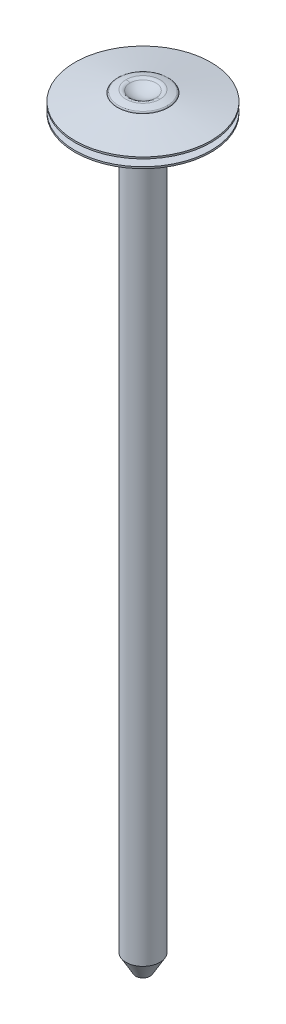
ISO-10303-21;
HEADER;
FILE_DESCRIPTION(('STEP AP214'),'2;1');
FILE_NAME('part.step','',(''),(''),'','','');
FILE_SCHEMA(('AUTOMOTIVE_DESIGN { 1 0 10303 214 1 1 1 1 }'));
ENDSEC;
DATA;
#1=APPLICATION_CONTEXT('core data for automotive mechanical design processes');
#2=APPLICATION_PROTOCOL_DEFINITION('international standard','automotive_design',2000,#1);
#3=PRODUCT_CONTEXT('',#1,'mechanical');
#4=PRODUCT('Part','Part','',(#3));
#5=PRODUCT_RELATED_PRODUCT_CATEGORY('part','',(#4));
#6=PRODUCT_DEFINITION_FORMATION('','',#4);
#7=PRODUCT_DEFINITION_CONTEXT('part definition',#1,'design');
#8=PRODUCT_DEFINITION('design','',#6,#7);
#9=PRODUCT_DEFINITION_SHAPE('','',#8);
#10=(LENGTH_UNIT() NAMED_UNIT(*) SI_UNIT(.MILLI.,.METRE.));
#11=(NAMED_UNIT(*) PLANE_ANGLE_UNIT() SI_UNIT($,.RADIAN.));
#12=(NAMED_UNIT(*) SI_UNIT($,.STERADIAN.) SOLID_ANGLE_UNIT());
#13=UNCERTAINTY_MEASURE_WITH_UNIT(LENGTH_MEASURE(1.E-05),#10,'distance_accuracy_value','');
#14=(GEOMETRIC_REPRESENTATION_CONTEXT(3) GLOBAL_UNCERTAINTY_ASSIGNED_CONTEXT((#13)) GLOBAL_UNIT_ASSIGNED_CONTEXT((#10,
#11,#12)) REPRESENTATION_CONTEXT('',''));
#15=CARTESIAN_POINT('',(0.,0.,0.));
#16=DIRECTION('',(0.,0.,1.));
#17=DIRECTION('',(1.,0.,0.));
#18=AXIS2_PLACEMENT_3D('',#15,#16,#17);
#19=CARTESIAN_POINT('',(-0.427721528,-22.5,-0.427721528));
#20=DIRECTION('',(0.,-1.,0.));
#21=DIRECTION('',(1.,0.,0.));
#22=AXIS2_PLACEMENT_3D('',#19,#20,#21);
#23=PLANE('',#22);
#24=CARTESIAN_POINT('',(0.,-22.5,0.));
#25=DIRECTION('',(0.,1.,0.));
#26=DIRECTION('',(0.,0.,1.));
#27=AXIS2_PLACEMENT_3D('',#24,#25,#26);
#28=CIRCLE('',#27,0.42264973100002);
#29=CARTESIAN_POINT('',(0.,-22.5,0.42264973100002));
#30=VERTEX_POINT('',#29);
#31=EDGE_CURVE('E21',#30,#30,#28,.F.);
#32=ORIENTED_EDGE('',*,*,#31,.T.);
#33=EDGE_LOOP('',(#32));
#34=FACE_BOUND('',#33,.T.);
#35=ADVANCED_FACE('F17',(#34),#23,.T.);
#36=CARTESIAN_POINT('',(0.,-22.5,0.));
#37=DIRECTION('',(0.,1.,0.));
#38=DIRECTION('',(0.,0.,1.));
#39=AXIS2_PLACEMENT_3D('',#36,#37,#38);
#40=CONICAL_SURFACE('',#39,0.422649731,0.523598775456081);
#41=ORIENTED_EDGE('',*,*,#31,.F.);
#42=EDGE_LOOP('',(#41));
#43=FACE_BOUND('',#42,.T.);
#44=CARTESIAN_POINT('',(0.,-21.5,0.));
#45=DIRECTION('',(0.,1.,0.));
#46=DIRECTION('',(-1.,0.,0.));
#47=AXIS2_PLACEMENT_3D('',#44,#45,#46);
#48=CIRCLE('',#47,1.);
#49=CARTESIAN_POINT('',(-1.,-21.5,0.));
#50=VERTEX_POINT('',#49);
#51=EDGE_CURVE('E274',#50,#50,#48,.F.);
#52=ORIENTED_EDGE('',*,*,#51,.T.);
#53=EDGE_LOOP('',(#52));
#54=FACE_BOUND('',#53,.T.);
#55=ADVANCED_FACE('F288',(#43,#54),#40,.T.);
#56=CARTESIAN_POINT('',(0.,-21.5,0.));
#57=DIRECTION('',(0.,1.,0.));
#58=DIRECTION('',(0.,0.,1.));
#59=AXIS2_PLACEMENT_3D('',#56,#57,#58);
#60=CYLINDRICAL_SURFACE('',#59,1.);
#61=ORIENTED_EDGE('',*,*,#51,.F.);
#62=EDGE_LOOP('',(#61));
#63=FACE_BOUND('',#62,.T.);
#64=CARTESIAN_POINT('',(0.,20.417189035,0.));
#65=DIRECTION('',(0.,1.,0.));
#66=DIRECTION('',(0.,0.,1.));
#67=AXIS2_PLACEMENT_3D('',#64,#65,#66);
#68=CIRCLE('',#67,1.);
#69=CARTESIAN_POINT('',(0.,20.417189035,0.999999999999927));
#70=VERTEX_POINT('',#69);
#71=EDGE_CURVE('E91',#70,#70,#68,.T.);
#72=ORIENTED_EDGE('',*,*,#71,.F.);
#73=EDGE_LOOP('',(#72));
#74=FACE_BOUND('',#73,.T.);
#75=ADVANCED_FACE('F290',(#63,#74),#60,.T.);
#76=CARTESIAN_POINT('',(-1.2144,20.417189035,-1.2144));
#77=DIRECTION('',(0.,-1.,0.));
#78=DIRECTION('',(1.,0.,0.));
#79=AXIS2_PLACEMENT_3D('',#76,#77,#78);
#80=PLANE('',#79);
#81=ORIENTED_EDGE('',*,*,#71,.T.);
#82=EDGE_LOOP('',(#81));
#83=FACE_BOUND('',#82,.T.);
#84=CARTESIAN_POINT('',(-1.20000000037468,20.4171890349051,0.));
#85=CARTESIAN_POINT('',(-1.20000000037468,20.4171890349051,2.40000000001333));
#86=CARTESIAN_POINT('',(1.20000000037468,20.4171890349051,2.40000000001333));
#87=CARTESIAN_POINT('',(1.20000000037468,20.4171890349051,0.));
#88=(BOUNDED_CURVE() B_SPLINE_CURVE(3,(#84,#85,#86,#87),.UNSPECIFIED.,.F.,
.F.) B_SPLINE_CURVE_WITH_KNOTS((4,4),(0.,1.),
.UNSPECIFIED.) CURVE() GEOMETRIC_REPRESENTATION_ITEM() RATIONAL_B_SPLINE_CURVE((0.98067743246058,
0.32689247748686,0.32689247748686,0.98067743246058)) REPRESENTATION_ITEM(''));
#89=CARTESIAN_POINT('',(-1.1999999999496,20.417189034943,0.));
#90=VERTEX_POINT('',#89);
#91=CARTESIAN_POINT('',(1.1999999999496,20.417189034943,0.));
#92=VERTEX_POINT('',#91);
#93=EDGE_CURVE('E72',#90,#92,#88,.T.);
#94=ORIENTED_EDGE('',*,*,#93,.F.);
#95=CARTESIAN_POINT('',(1.20000000037468,20.4171890349051,0.));
#96=CARTESIAN_POINT('',(1.20000000037468,20.4171890349051,-2.40000000001333));
#97=CARTESIAN_POINT('',(-1.20000000037468,20.4171890349051,-2.40000000001333));
#98=CARTESIAN_POINT('',(-1.20000000037468,20.4171890349051,0.));
#99=(BOUNDED_CURVE() B_SPLINE_CURVE(3,(#95,#96,#97,#98),.UNSPECIFIED.,.F.,
.F.) B_SPLINE_CURVE_WITH_KNOTS((4,4),(0.,1.),
.UNSPECIFIED.) CURVE() GEOMETRIC_REPRESENTATION_ITEM() RATIONAL_B_SPLINE_CURVE((0.980677432460579,
0.32689247748686,0.32689247748686,0.980677432460579)) REPRESENTATION_ITEM(''));
#100=EDGE_CURVE('E78',#92,#90,#99,.T.);
#101=ORIENTED_EDGE('',*,*,#100,.F.);
#102=EDGE_LOOP('',(#94,#101));
#103=FACE_BOUND('',#102,.T.);
#104=ADVANCED_FACE('F90',(#83,#103),#80,.T.);
#105=CARTESIAN_POINT('',(-1.339316172,20.473693375,0.));
#106=CARTESIAN_POINT('',(-1.339316172,20.473693375,2.678632344));
#107=CARTESIAN_POINT('',(1.339316172,20.473693375,2.678632344));
#108=CARTESIAN_POINT('',(1.339316172,20.473693375,0.));
#109=CARTESIAN_POINT('',(-1.296301119,20.431931188,0.));
#110=CARTESIAN_POINT('',(-1.296301119,20.431931188,2.592602237));
#111=CARTESIAN_POINT('',(1.296301119,20.431931188,2.592602237));
#112=CARTESIAN_POINT('',(1.296301119,20.431931188,0.));
#113=CARTESIAN_POINT('',(-1.239686908,20.412202878,0.));
#114=CARTESIAN_POINT('',(-1.239686908,20.412202878,2.479373816));
#115=CARTESIAN_POINT('',(1.239686908,20.412202878,2.479373816));
#116=CARTESIAN_POINT('',(1.239686908,20.412202878,0.));
#117=CARTESIAN_POINT('',(-1.180033317,20.418188202,0.));
#118=CARTESIAN_POINT('',(-1.180033317,20.418188202,2.360066633));
#119=CARTESIAN_POINT('',(1.180033317,20.418188202,2.360066633));
#120=CARTESIAN_POINT('',(1.180033317,20.418188202,0.));
#121=(BOUNDED_SURFACE() B_SPLINE_SURFACE(3,3,((#105,#106,#107,#108),(#109,#110,#111,#112),(#113,
#114,#115,#116),(#117,#118,#119,#120)),.UNSPECIFIED.,.F.,.F.,
.F.) B_SPLINE_SURFACE_WITH_KNOTS((4,4),(4,4),(0.,1.),(0.,1.),
.UNSPECIFIED.) GEOMETRIC_REPRESENTATION_ITEM() RATIONAL_B_SPLINE_SURFACE(((1.,0.333333333333333,
0.333333333333333,1.),(0.937826113755156,0.312608704585052,0.312608704585052,0.937826113755156),
(0.937826113755156,0.312608704585052,0.312608704585052,0.937826113755156),(1.,0.333333333333333,
0.333333333333333,1.))) REPRESENTATION_ITEM('') SURFACE());
#122=CARTESIAN_POINT('',(0.,20.460501847,0.));
#123=DIRECTION('',(0.,1.,0.));
#124=DIRECTION('',(-1.,0.,0.));
#125=AXIS2_PLACEMENT_3D('',#122,#123,#124);
#126=CIRCLE('',#125,1.324294509);
#127=CARTESIAN_POINT('',(1.324294509143,20.4605018467957,-4.0742601623989E-10));
#128=VERTEX_POINT('',#127);
#129=CARTESIAN_POINT('',(-1.32429450915461,20.4605018468048,-1.18913209071357E-10));
#130=VERTEX_POINT('',#129);
#131=EDGE_CURVE('E95',#128,#130,#126,.F.);
#132=CARTESIAN_POINT('',(-1.339316172,20.473693375,0.));
#133=CARTESIAN_POINT('',(-1.296301119,20.431931188,0.));
#134=CARTESIAN_POINT('',(-1.239686908,20.412202878,0.));
#135=CARTESIAN_POINT('',(-1.180033317,20.418188202,0.));
#136=(BOUNDED_CURVE() B_SPLINE_CURVE(3,(#132,#133,#134,#135),.UNSPECIFIED.,.F.,
.F.) B_SPLINE_CURVE_WITH_KNOTS((4,4),(0.,1.),
.UNSPECIFIED.) CURVE() GEOMETRIC_REPRESENTATION_ITEM() RATIONAL_B_SPLINE_CURVE((1.,
0.937826113755156,0.937826113755156,1.)) REPRESENTATION_ITEM(''));
#137=EDGE_CURVE('E82',#90,#130,#136,.F.);
#138=CARTESIAN_POINT('',(1.339316172,20.473693375,0.));
#139=CARTESIAN_POINT('',(1.296301119,20.431931188,0.));
#140=CARTESIAN_POINT('',(1.239686908,20.412202878,0.));
#141=CARTESIAN_POINT('',(1.180033317,20.418188202,0.));
#142=(BOUNDED_CURVE() B_SPLINE_CURVE(3,(#138,#139,#140,#141),.UNSPECIFIED.,.F.,
.F.) B_SPLINE_CURVE_WITH_KNOTS((4,4),(0.,1.),
.UNSPECIFIED.) CURVE() GEOMETRIC_REPRESENTATION_ITEM() RATIONAL_B_SPLINE_CURVE((1.,
0.937826113755156,0.937826113755156,1.)) REPRESENTATION_ITEM(''));
#143=EDGE_CURVE('E84',#128,#92,#142,.T.);
#144=ORIENTED_EDGE('',*,*,#131,.T.);
#145=ORIENTED_EDGE('',*,*,#137,.F.);
#146=ORIENTED_EDGE('',*,*,#93,.T.);
#147=ORIENTED_EDGE('',*,*,#143,.F.);
#148=EDGE_LOOP('',(#144,#145,#146,#147));
#149=FACE_BOUND('',#148,.T.);
#150=ADVANCED_FACE('F94',(#149),#121,.T.);
#151=CARTESIAN_POINT('',(1.339316172,20.473693375,0.));
#152=CARTESIAN_POINT('',(1.339316172,20.473693375,-2.678632344));
#153=CARTESIAN_POINT('',(-1.339316172,20.473693375,-2.678632344));
#154=CARTESIAN_POINT('',(-1.339316172,20.473693375,0.));
#155=CARTESIAN_POINT('',(1.296301119,20.431931188,0.));
#156=CARTESIAN_POINT('',(1.296301119,20.431931188,-2.592602237));
#157=CARTESIAN_POINT('',(-1.296301119,20.431931188,-2.592602237));
#158=CARTESIAN_POINT('',(-1.296301119,20.431931188,0.));
#159=CARTESIAN_POINT('',(1.239686908,20.412202878,0.));
#160=CARTESIAN_POINT('',(1.239686908,20.412202878,-2.479373816));
#161=CARTESIAN_POINT('',(-1.239686908,20.412202878,-2.479373816));
#162=CARTESIAN_POINT('',(-1.239686908,20.412202878,0.));
#163=CARTESIAN_POINT('',(1.180033317,20.418188202,0.));
#164=CARTESIAN_POINT('',(1.180033317,20.418188202,-2.360066633));
#165=CARTESIAN_POINT('',(-1.180033317,20.418188202,-2.360066633));
#166=CARTESIAN_POINT('',(-1.180033317,20.418188202,0.));
#167=(BOUNDED_SURFACE() B_SPLINE_SURFACE(3,3,((#151,#152,#153,#154),(#155,#156,#157,#158),(#159,
#160,#161,#162),(#163,#164,#165,#166)),.UNSPECIFIED.,.F.,.F.,
.F.) B_SPLINE_SURFACE_WITH_KNOTS((4,4),(4,4),(0.,1.),(0.,1.),
.UNSPECIFIED.) GEOMETRIC_REPRESENTATION_ITEM() RATIONAL_B_SPLINE_SURFACE(((1.,0.333333333333333,
0.333333333333333,1.),(0.937826113755156,0.312608704585052,0.312608704585052,0.937826113755156),
(0.937826113755156,0.312608704585052,0.312608704585052,0.937826113755156),(1.,0.333333333333333,
0.333333333333333,1.))) REPRESENTATION_ITEM('') SURFACE());
#168=CARTESIAN_POINT('',(0.,20.460501847,0.));
#169=DIRECTION('',(0.,1.,0.));
#170=DIRECTION('',(-1.,0.,0.));
#171=AXIS2_PLACEMENT_3D('',#168,#169,#170);
#172=CIRCLE('',#171,1.324294509);
#173=EDGE_CURVE('E98',#130,#128,#172,.F.);
#174=ORIENTED_EDGE('',*,*,#137,.T.);
#175=ORIENTED_EDGE('',*,*,#173,.T.);
#176=ORIENTED_EDGE('',*,*,#143,.T.);
#177=ORIENTED_EDGE('',*,*,#100,.T.);
#178=EDGE_LOOP('',(#174,#175,#176,#177));
#179=FACE_BOUND('',#178,.T.);
#180=ADVANCED_FACE('F80',(#179),#167,.T.);
#181=CARTESIAN_POINT('',(0.,20.460501847,0.));
#182=DIRECTION('',(0.,1.,0.));
#183=DIRECTION('',(0.,0.,1.));
#184=AXIS2_PLACEMENT_3D('',#181,#182,#183);
#185=CONICAL_SURFACE('',#184,1.324294509,0.90017542204764);
#186=ORIENTED_EDGE('',*,*,#173,.F.);
#187=ORIENTED_EDGE('',*,*,#131,.F.);
#188=EDGE_LOOP('',(#186,#187));
#189=FACE_BOUND('',#188,.T.);
#190=CARTESIAN_POINT('',(0.,20.917189035,0.));
#191=DIRECTION('',(0.,1.,0.));
#192=DIRECTION('',(-1.,0.,0.));
#193=AXIS2_PLACEMENT_3D('',#190,#191,#192);
#194=CIRCLE('',#193,1.9);
#195=CARTESIAN_POINT('',(-1.9,20.917189035,0.));
#196=VERTEX_POINT('',#195);
#197=EDGE_CURVE('E118',#196,#196,#194,.F.);
#198=ORIENTED_EDGE('',*,*,#197,.T.);
#199=EDGE_LOOP('',(#198));
#200=FACE_BOUND('',#199,.T.);
#201=ADVANCED_FACE('F245',(#189,#200),#185,.T.);
#202=CARTESIAN_POINT('',(0.,20.917189035,0.));
#203=DIRECTION('',(0.,1.,0.));
#204=DIRECTION('',(0.,0.,1.));
#205=AXIS2_PLACEMENT_3D('',#202,#203,#204);
#206=CONICAL_SURFACE('',#205,1.9,1.39626340182073);
#207=ORIENTED_EDGE('',*,*,#197,.F.);
#208=EDGE_LOOP('',(#207));
#209=FACE_BOUND('',#208,.T.);
#210=CARTESIAN_POINT('',(0.,21.287475694,0.));
#211=DIRECTION('',(0.,1.,0.));
#212=DIRECTION('',(-1.,0.,0.));
#213=AXIS2_PLACEMENT_3D('',#210,#211,#212);
#214=CIRCLE('',#213,4.);
#215=CARTESIAN_POINT('',(-4.,21.287475694,0.));
#216=VERTEX_POINT('',#215);
#217=EDGE_CURVE('E123',#216,#216,#214,.F.);
#218=ORIENTED_EDGE('',*,*,#217,.T.);
#219=EDGE_LOOP('',(#218));
#220=FACE_BOUND('',#219,.T.);
#221=ADVANCED_FACE('F241',(#209,#220),#206,.T.);
#222=CARTESIAN_POINT('',(0.,21.287475694,0.));
#223=DIRECTION('',(0.,1.,0.));
#224=DIRECTION('',(0.,0.,1.));
#225=AXIS2_PLACEMENT_3D('',#222,#223,#224);
#226=CYLINDRICAL_SURFACE('',#225,4.);
#227=ORIENTED_EDGE('',*,*,#217,.F.);
#228=EDGE_LOOP('',(#227));
#229=FACE_BOUND('',#228,.T.);
#230=CARTESIAN_POINT('',(0.,21.387475694,0.));
#231=DIRECTION('',(0.,1.,0.));
#232=DIRECTION('',(0.,0.,1.));
#233=AXIS2_PLACEMENT_3D('',#230,#231,#232);
#234=CIRCLE('',#233,4.);
#235=CARTESIAN_POINT('',(0.,21.387475694,4.));
#236=VERTEX_POINT('',#235);
#237=EDGE_CURVE('E139',#236,#236,#234,.T.);
#238=ORIENTED_EDGE('',*,*,#237,.F.);
#239=EDGE_LOOP('',(#238));
#240=FACE_BOUND('',#239,.T.);
#241=ADVANCED_FACE('F232',(#229,#240),#226,.T.);
#242=CARTESIAN_POINT('',(-0.740041151,22.429704828,0.));
#243=CARTESIAN_POINT('',(-0.740041151,22.429704828,1.480082302));
#244=CARTESIAN_POINT('',(0.740041151,22.429704828,1.480082302));
#245=CARTESIAN_POINT('',(0.740041151,22.429704828,0.));
#246=CARTESIAN_POINT('',(-0.820504151,22.501646476,0.));
#247=CARTESIAN_POINT('',(-0.820504151,22.501646476,1.641008303));
#248=CARTESIAN_POINT('',(0.820504151,22.501646476,1.641008303));
#249=CARTESIAN_POINT('',(0.820504151,22.501646476,0.));
#250=CARTESIAN_POINT('',(-0.925974632,22.524578396,0.));
#251=CARTESIAN_POINT('',(-0.925974632,22.524578396,1.851949264));
#252=CARTESIAN_POINT('',(0.925974632,22.524578396,1.851949264));
#253=CARTESIAN_POINT('',(0.925974632,22.524578396,0.));
#254=CARTESIAN_POINT('',(-1.029045162,22.492541525,0.));
#255=CARTESIAN_POINT('',(-1.029045162,22.492541525,2.058090323));
#256=CARTESIAN_POINT('',(1.029045162,22.492541525,2.058090323));
#257=CARTESIAN_POINT('',(1.029045162,22.492541525,0.));
#258=(BOUNDED_SURFACE() B_SPLINE_SURFACE(3,3,((#242,#243,#244,#245),(#246,#247,#248,#249),(#250,
#251,#252,#253),(#254,#255,#256,#257)),.UNSPECIFIED.,.F.,.F.,
.F.) B_SPLINE_SURFACE_WITH_KNOTS((4,4),(4,4),(0.,1.),(0.,1.),
.UNSPECIFIED.) GEOMETRIC_REPRESENTATION_ITEM() RATIONAL_B_SPLINE_SURFACE(((1.,0.333333333333333,
0.333333333333333,1.),(0.913380406116214,0.304460135372071,0.304460135372071,0.913380406116214),
(0.913380406116214,0.304460135372071,0.304460135372071,0.913380406116214),(1.,0.333333333333333,
0.333333333333333,1.))) REPRESENTATION_ITEM('') SURFACE());
#259=CARTESIAN_POINT('',(0.,22.4485501166531,0.));
#260=DIRECTION('',(0.,-1.,0.));
#261=DIRECTION('',(0.,0.,-1.));
#262=AXIS2_PLACEMENT_3D('',#259,#260,#261);
#263=CIRCLE('',#262,0.763367216693138);
#264=CARTESIAN_POINT('',(0.763367211631518,22.4485501132003,-1.56566566001301E-10));
#265=VERTEX_POINT('',#264);
#266=CARTESIAN_POINT('',(-0.763367210366113,22.4485501123371,-1.71397094282999E-11));
#267=VERTEX_POINT('',#266);
#268=EDGE_CURVE('E130',#265,#267,#263,.T.);
#269=CARTESIAN_POINT('',(-0.740041151,22.429704828,0.));
#270=CARTESIAN_POINT('',(-0.820504151,22.501646476,0.));
#271=CARTESIAN_POINT('',(-0.925974632,22.524578396,0.));
#272=CARTESIAN_POINT('',(-1.029045162,22.492541525,0.));
#273=(BOUNDED_CURVE() B_SPLINE_CURVE(3,(#269,#270,#271,#272),.UNSPECIFIED.,.F.,
.F.) B_SPLINE_CURVE_WITH_KNOTS((4,4),(0.,1.),
.UNSPECIFIED.) CURVE() GEOMETRIC_REPRESENTATION_ITEM() RATIONAL_B_SPLINE_CURVE((1.,
0.913380406116214,0.913380406116214,1.)) REPRESENTATION_ITEM(''));
#274=CARTESIAN_POINT('',(-1.00000002400024,22.4999999949619,-4.49003078317863E-11));
#275=VERTEX_POINT('',#274);
#276=EDGE_CURVE('E135',#267,#275,#273,.T.);
#277=CARTESIAN_POINT('',(0.,22.4999999902004,0.));
#278=DIRECTION('',(0.,1.,0.));
#279=DIRECTION('',(-1.,0.,0.));
#280=AXIS2_PLACEMENT_3D('',#277,#278,#279);
#281=CIRCLE('',#280,1.00000004757387);
#282=CARTESIAN_POINT('',(1.00000001810684,22.4999999961522,-1.53824960093541E-10));
#283=VERTEX_POINT('',#282);
#284=EDGE_CURVE('E140',#275,#283,#281,.T.);
#285=CARTESIAN_POINT('',(0.740041151,22.429704828,0.));
#286=CARTESIAN_POINT('',(0.820504151,22.501646476,0.));
#287=CARTESIAN_POINT('',(0.925974632,22.524578396,0.));
#288=CARTESIAN_POINT('',(1.029045162,22.492541525,0.));
#289=(BOUNDED_CURVE() B_SPLINE_CURVE(3,(#285,#286,#287,#288),.UNSPECIFIED.,.F.,
.F.) B_SPLINE_CURVE_WITH_KNOTS((4,4),(0.,1.),
.UNSPECIFIED.) CURVE() GEOMETRIC_REPRESENTATION_ITEM() RATIONAL_B_SPLINE_CURVE((1.,
0.913380406116214,0.913380406116214,1.)) REPRESENTATION_ITEM(''));
#290=EDGE_CURVE('E126',#283,#265,#289,.F.);
#291=ORIENTED_EDGE('',*,*,#268,.T.);
#292=ORIENTED_EDGE('',*,*,#276,.T.);
#293=ORIENTED_EDGE('',*,*,#284,.T.);
#294=ORIENTED_EDGE('',*,*,#290,.T.);
#295=EDGE_LOOP('',(#291,#292,#293,#294));
#296=FACE_BOUND('',#295,.T.);
#297=ADVANCED_FACE('F227',(#296),#258,.T.);
#298=CARTESIAN_POINT('',(4.048,21.387475694,-4.048));
#299=DIRECTION('',(0.,1.,0.));
#300=DIRECTION('',(-1.,0.,0.));
#301=AXIS2_PLACEMENT_3D('',#298,#299,#300);
#302=PLANE('',#301);
#303=CARTESIAN_POINT('',(0.,21.387475694,0.));
#304=DIRECTION('',(0.,1.,0.));
#305=DIRECTION('',(0.,0.,1.));
#306=AXIS2_PLACEMENT_3D('',#303,#304,#305);
#307=CIRCLE('',#306,1.5);
#308=CARTESIAN_POINT('',(0.,21.387475694,1.5));
#309=VERTEX_POINT('',#308);
#310=EDGE_CURVE('E146',#309,#309,#307,.F.);
#311=ORIENTED_EDGE('',*,*,#310,.T.);
#312=EDGE_LOOP('',(#311));
#313=FACE_BOUND('',#312,.T.);
#314=ORIENTED_EDGE('',*,*,#237,.T.);
#315=EDGE_LOOP('',(#314));
#316=FACE_BOUND('',#315,.T.);
#317=ADVANCED_FACE('F225',(#313,#316),#302,.T.);
#318=CARTESIAN_POINT('',(0.,21.387475694,0.));
#319=DIRECTION('',(0.,1.,0.));
#320=DIRECTION('',(0.,0.,1.));
#321=AXIS2_PLACEMENT_3D('',#318,#319,#320);
#322=CYLINDRICAL_SURFACE('',#321,1.5);
#323=ORIENTED_EDGE('',*,*,#310,.F.);
#324=EDGE_LOOP('',(#323));
#325=FACE_BOUND('',#324,.T.);
#326=CARTESIAN_POINT('',(0.,21.787475694,0.));
#327=DIRECTION('',(0.,1.,0.));
#328=DIRECTION('',(0.,0.,1.));
#329=AXIS2_PLACEMENT_3D('',#326,#327,#328);
#330=CIRCLE('',#329,1.5);
#331=CARTESIAN_POINT('',(0.,21.787475694,1.5));
#332=VERTEX_POINT('',#331);
#333=EDGE_CURVE('E159',#332,#332,#330,.T.);
#334=ORIENTED_EDGE('',*,*,#333,.F.);
#335=EDGE_LOOP('',(#334));
#336=FACE_BOUND('',#335,.T.);
#337=ADVANCED_FACE('F217',(#325,#336),#322,.T.);
#338=CARTESIAN_POINT('',(-1.418861506,22.394968377,0.));
#339=CARTESIAN_POINT('',(-1.418861506,22.394968377,2.837723012));
#340=CARTESIAN_POINT('',(1.418861506,22.394968377,2.837723012));
#341=CARTESIAN_POINT('',(1.418861506,22.394968377,0.));
#342=CARTESIAN_POINT('',(-1.448284092,22.389317405,0.));
#343=CARTESIAN_POINT('',(-1.448284092,22.389317405,2.896568184));
#344=CARTESIAN_POINT('',(1.448284092,22.389317405,2.896568184));
#345=CARTESIAN_POINT('',(1.448284092,22.389317405,0.));
#346=CARTESIAN_POINT('',(-1.472583604,22.371791545,0.));
#347=CARTESIAN_POINT('',(-1.472583604,22.371791545,2.945167207));
#348=CARTESIAN_POINT('',(1.472583604,22.371791545,2.945167207));
#349=CARTESIAN_POINT('',(1.472583604,22.371791545,0.));
#350=CARTESIAN_POINT('',(-1.487232179,22.345656487,0.));
#351=CARTESIAN_POINT('',(-1.487232179,22.345656487,2.974464358));
#352=CARTESIAN_POINT('',(1.487232179,22.345656487,2.974464358));
#353=CARTESIAN_POINT('',(1.487232179,22.345656487,0.));
#354=(BOUNDED_SURFACE() B_SPLINE_SURFACE(3,3,((#338,#339,#340,#341),(#342,#343,#344,#345),(#346,
#347,#348,#349),(#350,#351,#352,#353)),.UNSPECIFIED.,.F.,.F.,
.F.) B_SPLINE_SURFACE_WITH_KNOTS((4,4),(4,4),(0.,1.),(0.,1.),
.UNSPECIFIED.) GEOMETRIC_REPRESENTATION_ITEM() RATIONAL_B_SPLINE_SURFACE(((1.,0.333333333333333,
0.333333333333333,1.),(0.937888160562527,0.312629386854176,0.312629386854176,0.937888160562527),
(0.937888160562527,0.312629386854176,0.312629386854176,0.937888160562527),(1.,0.333333333333333,
0.333333333333333,1.))) REPRESENTATION_ITEM('') SURFACE());
#355=CARTESIAN_POINT('',(0.,22.3925947517985,0.));
#356=DIRECTION('',(0.,-1.,0.));
#357=DIRECTION('',(0.,0.,-1.));
#358=AXIS2_PLACEMENT_3D('',#355,#356,#357);
#359=CIRCLE('',#358,1.42857142865813);
#360=CARTESIAN_POINT('',(1.42857145272424,22.3925947446131,-2.92999919938259E-10));
#361=VERTEX_POINT('',#360);
#362=CARTESIAN_POINT('',(-1.42857145874077,22.3925947428167,-3.20753888810154E-11));
#363=VERTEX_POINT('',#362);
#364=EDGE_CURVE('E151',#361,#363,#359,.T.);
#365=CARTESIAN_POINT('',(-1.418861506,22.394968377,0.));
#366=CARTESIAN_POINT('',(-1.448284092,22.389317405,0.));
#367=CARTESIAN_POINT('',(-1.472583604,22.371791545,0.));
#368=CARTESIAN_POINT('',(-1.487232179,22.345656487,0.));
#369=(BOUNDED_CURVE() B_SPLINE_CURVE(3,(#365,#366,#367,#368),.UNSPECIFIED.,.F.,
.F.) B_SPLINE_CURVE_WITH_KNOTS((4,4),(0.,1.),
.UNSPECIFIED.) CURVE() GEOMETRIC_REPRESENTATION_ITEM() RATIONAL_B_SPLINE_CURVE((1.,
0.937888160562527,0.937888160562527,1.)) REPRESENTATION_ITEM(''));
#370=CARTESIAN_POINT('',(-1.48191520421172,22.3541209109272,-3.03945889109401E-10));
#371=VERTEX_POINT('',#370);
#372=EDGE_CURVE('E36',#363,#371,#369,.T.);
#373=CARTESIAN_POINT('',(0.,22.354120911,0.));
#374=DIRECTION('',(0.,-1.,0.));
#375=DIRECTION('',(1.,0.,0.));
#376=AXIS2_PLACEMENT_3D('',#373,#374,#375);
#377=CIRCLE('',#376,1.481915204);
#378=CARTESIAN_POINT('',(1.48191520421172,22.3541209109272,-6.6533271595434E-11));
#379=VERTEX_POINT('',#378);
#380=EDGE_CURVE('E168',#371,#379,#377,.F.);
#381=CARTESIAN_POINT('',(1.418861506,22.394968377,0.));
#382=CARTESIAN_POINT('',(1.448284092,22.389317405,0.));
#383=CARTESIAN_POINT('',(1.472583604,22.371791545,0.));
#384=CARTESIAN_POINT('',(1.487232179,22.345656487,0.));
#385=(BOUNDED_CURVE() B_SPLINE_CURVE(3,(#381,#382,#383,#384),.UNSPECIFIED.,.F.,
.F.) B_SPLINE_CURVE_WITH_KNOTS((4,4),(0.,1.),
.UNSPECIFIED.) CURVE() GEOMETRIC_REPRESENTATION_ITEM() RATIONAL_B_SPLINE_CURVE((1.,
0.937888160562527,0.937888160562527,1.)) REPRESENTATION_ITEM(''));
#386=EDGE_CURVE('E147',#379,#361,#385,.F.);
#387=ORIENTED_EDGE('',*,*,#364,.T.);
#388=ORIENTED_EDGE('',*,*,#372,.T.);
#389=ORIENTED_EDGE('',*,*,#380,.T.);
#390=ORIENTED_EDGE('',*,*,#386,.T.);
#391=EDGE_LOOP('',(#387,#388,#389,#390));
#392=FACE_BOUND('',#391,.T.);
#393=ADVANCED_FACE('F212',(#392),#354,.T.);
#394=CARTESIAN_POINT('',(-4.048,21.787475694,-4.048));
#395=DIRECTION('',(0.,-1.,0.));
#396=DIRECTION('',(1.,0.,0.));
#397=AXIS2_PLACEMENT_3D('',#394,#395,#396);
#398=PLANE('',#397);
#399=ORIENTED_EDGE('',*,*,#333,.T.);
#400=EDGE_LOOP('',(#399));
#401=FACE_BOUND('',#400,.T.);
#402=CARTESIAN_POINT('',(0.,21.787475694,0.));
#403=DIRECTION('',(0.,1.,0.));
#404=DIRECTION('',(0.,0.,1.));
#405=AXIS2_PLACEMENT_3D('',#402,#403,#404);
#406=CIRCLE('',#405,4.);
#407=CARTESIAN_POINT('',(0.,21.787475694,4.));
#408=VERTEX_POINT('',#407);
#409=EDGE_CURVE('E167',#408,#408,#406,.F.);
#410=ORIENTED_EDGE('',*,*,#409,.T.);
#411=EDGE_LOOP('',(#410));
#412=FACE_BOUND('',#411,.T.);
#413=ADVANCED_FACE('F19',(#401,#412),#398,.T.);
#414=CARTESIAN_POINT('',(0.,21.787475694,0.));
#415=DIRECTION('',(0.,1.,0.));
#416=DIRECTION('',(0.,0.,1.));
#417=AXIS2_PLACEMENT_3D('',#414,#415,#416);
#418=CYLINDRICAL_SURFACE('',#417,4.);
#419=ORIENTED_EDGE('',*,*,#409,.F.);
#420=EDGE_LOOP('',(#419));
#421=FACE_BOUND('',#420,.T.);
#422=CARTESIAN_POINT('',(0.,21.887475694,0.));
#423=DIRECTION('',(0.,-1.,0.));
#424=DIRECTION('',(1.,0.,0.));
#425=AXIS2_PLACEMENT_3D('',#422,#423,#424);
#426=CIRCLE('',#425,4.);
#427=CARTESIAN_POINT('',(4.,21.887475694,0.));
#428=VERTEX_POINT('',#427);
#429=EDGE_CURVE('E160',#428,#428,#426,.T.);
#430=ORIENTED_EDGE('',*,*,#429,.T.);
#431=EDGE_LOOP('',(#430));
#432=FACE_BOUND('',#431,.T.);
#433=ADVANCED_FACE('F207',(#421,#432),#418,.T.);
#434=CARTESIAN_POINT('',(0.,22.328293146,0.));
#435=DIRECTION('',(0.,-1.,0.));
#436=DIRECTION('',(0.,0.,-1.));
#437=AXIS2_PLACEMENT_3D('',#434,#435,#436);
#438=CONICAL_SURFACE('',#437,1.5,1.39626340150669);
#439=CARTESIAN_POINT('',(0.,22.328293146,0.));
#440=DIRECTION('',(0.,-1.,0.));
#441=DIRECTION('',(1.,0.,0.));
#442=AXIS2_PLACEMENT_3D('',#439,#440,#441);
#443=CIRCLE('',#442,1.5);
#444=CARTESIAN_POINT('',(1.5,22.328293146,0.));
#445=VERTEX_POINT('',#444);
#446=EDGE_CURVE('E166',#445,#445,#443,.T.);
#447=ORIENTED_EDGE('',*,*,#446,.T.);
#448=EDGE_LOOP('',(#447));
#449=FACE_BOUND('',#448,.T.);
#450=ORIENTED_EDGE('',*,*,#429,.F.);
#451=EDGE_LOOP('',(#450));
#452=FACE_BOUND('',#451,.T.);
#453=ADVANCED_FACE('F203',(#449,#452),#438,.T.);
#454=CARTESIAN_POINT('',(0.,22.354120911,0.));
#455=DIRECTION('',(0.,-1.,0.));
#456=DIRECTION('',(0.,0.,-1.));
#457=AXIS2_PLACEMENT_3D('',#454,#455,#456);
#458=CONICAL_SURFACE('',#457,1.481915204,0.610865244742133);
#459=ORIENTED_EDGE('',*,*,#446,.F.);
#460=EDGE_LOOP('',(#459));
#461=FACE_BOUND('',#460,.T.);
#462=CARTESIAN_POINT('',(0.,22.3541209108544,0.));
#463=DIRECTION('',(0.,1.,0.));
#464=DIRECTION('',(0.,0.,1.));
#465=AXIS2_PLACEMENT_3D('',#462,#463,#464);
#466=CIRCLE('',#465,1.48191520442341);
#467=EDGE_CURVE('E172',#379,#371,#466,.T.);
#468=ORIENTED_EDGE('',*,*,#467,.F.);
#469=ORIENTED_EDGE('',*,*,#380,.F.);
#470=EDGE_LOOP('',(#468,#469));
#471=FACE_BOUND('',#470,.T.);
#472=ADVANCED_FACE('F194',(#461,#471),#458,.T.);
#473=CARTESIAN_POINT('',(1.418861506,22.394968377,0.));
#474=CARTESIAN_POINT('',(1.418861506,22.394968377,-2.837723012));
#475=CARTESIAN_POINT('',(-1.418861506,22.394968377,-2.837723012));
#476=CARTESIAN_POINT('',(-1.418861506,22.394968377,0.));
#477=CARTESIAN_POINT('',(1.448284092,22.389317405,0.));
#478=CARTESIAN_POINT('',(1.448284092,22.389317405,-2.896568184));
#479=CARTESIAN_POINT('',(-1.448284092,22.389317405,-2.896568184));
#480=CARTESIAN_POINT('',(-1.448284092,22.389317405,0.));
#481=CARTESIAN_POINT('',(1.472583604,22.371791545,0.));
#482=CARTESIAN_POINT('',(1.472583604,22.371791545,-2.945167207));
#483=CARTESIAN_POINT('',(-1.472583604,22.371791545,-2.945167207));
#484=CARTESIAN_POINT('',(-1.472583604,22.371791545,0.));
#485=CARTESIAN_POINT('',(1.487232179,22.345656487,0.));
#486=CARTESIAN_POINT('',(1.487232179,22.345656487,-2.974464358));
#487=CARTESIAN_POINT('',(-1.487232179,22.345656487,-2.974464358));
#488=CARTESIAN_POINT('',(-1.487232179,22.345656487,0.));
#489=(BOUNDED_SURFACE() B_SPLINE_SURFACE(3,3,((#473,#474,#475,#476),(#477,#478,#479,#480),(#481,
#482,#483,#484),(#485,#486,#487,#488)),.UNSPECIFIED.,.F.,.F.,
.F.) B_SPLINE_SURFACE_WITH_KNOTS((4,4),(4,4),(0.,1.),(0.,1.),
.UNSPECIFIED.) GEOMETRIC_REPRESENTATION_ITEM() RATIONAL_B_SPLINE_SURFACE(((1.,0.333333333333333,
0.333333333333333,1.),(0.937888160562527,0.312629386854176,0.312629386854176,0.937888160562527),
(0.937888160562527,0.312629386854176,0.312629386854176,0.937888160562527),(1.,0.333333333333333,
0.333333333333333,1.))) REPRESENTATION_ITEM('') SURFACE());
#490=CARTESIAN_POINT('',(0.,22.3925947374277,0.));
#491=DIRECTION('',(0.,1.,0.));
#492=DIRECTION('',(-1.,0.,0.));
#493=AXIS2_PLACEMENT_3D('',#490,#491,#492);
#494=CIRCLE('',#493,1.42857147679036);
#495=EDGE_CURVE('E174',#363,#361,#494,.F.);
#496=ORIENTED_EDGE('',*,*,#372,.F.);
#497=ORIENTED_EDGE('',*,*,#495,.T.);
#498=ORIENTED_EDGE('',*,*,#386,.F.);
#499=ORIENTED_EDGE('',*,*,#467,.T.);
#500=EDGE_LOOP('',(#496,#497,#498,#499));
#501=FACE_BOUND('',#500,.T.);
#502=ADVANCED_FACE('F185',(#501),#489,.T.);
#503=CARTESIAN_POINT('',(4.33498570373558E-10,17.6010205144335,0.));
#504=DIRECTION('',(0.,1.,0.));
#505=DIRECTION('',(1.,0.,0.));
#506=AXIS2_PLACEMENT_3D('',#503,#504,#505);
#507=SPHERICAL_SURFACE('',#506,5.);
#508=ORIENTED_EDGE('',*,*,#284,.F.);
#509=CARTESIAN_POINT('',(0.,22.4999999997233,0.));
#510=DIRECTION('',(0.,1.,0.));
#511=DIRECTION('',(0.,0.,1.));
#512=AXIS2_PLACEMENT_3D('',#509,#510,#511);
#513=CIRCLE('',#512,1.00000000042662);
#514=EDGE_CURVE('E27',#283,#275,#513,.T.);
#515=ORIENTED_EDGE('',*,*,#514,.F.);
#516=EDGE_LOOP('',(#508,#515));
#517=FACE_BOUND('',#516,.T.);
#518=ORIENTED_EDGE('',*,*,#495,.F.);
#519=ORIENTED_EDGE('',*,*,#364,.F.);
#520=EDGE_LOOP('',(#518,#519));
#521=FACE_BOUND('',#520,.T.);
#522=ADVANCED_FACE('F180',(#517,#521),#507,.T.);
#523=CARTESIAN_POINT('',(0.740041151,22.429704828,0.));
#524=CARTESIAN_POINT('',(0.740041151,22.429704828,-1.480082302));
#525=CARTESIAN_POINT('',(-0.740041151,22.429704828,-1.480082302));
#526=CARTESIAN_POINT('',(-0.740041151,22.429704828,0.));
#527=CARTESIAN_POINT('',(0.820504151,22.501646476,0.));
#528=CARTESIAN_POINT('',(0.820504151,22.501646476,-1.641008303));
#529=CARTESIAN_POINT('',(-0.820504151,22.501646476,-1.641008303));
#530=CARTESIAN_POINT('',(-0.820504151,22.501646476,0.));
#531=CARTESIAN_POINT('',(0.925974632,22.524578396,0.));
#532=CARTESIAN_POINT('',(0.925974632,22.524578396,-1.851949264));
#533=CARTESIAN_POINT('',(-0.925974632,22.524578396,-1.851949264));
#534=CARTESIAN_POINT('',(-0.925974632,22.524578396,0.));
#535=CARTESIAN_POINT('',(1.029045162,22.492541525,0.));
#536=CARTESIAN_POINT('',(1.029045162,22.492541525,-2.058090323));
#537=CARTESIAN_POINT('',(-1.029045162,22.492541525,-2.058090323));
#538=CARTESIAN_POINT('',(-1.029045162,22.492541525,0.));
#539=(BOUNDED_SURFACE() B_SPLINE_SURFACE(3,3,((#523,#524,#525,#526),(#527,#528,#529,#530),(#531,
#532,#533,#534),(#535,#536,#537,#538)),.UNSPECIFIED.,.F.,.F.,
.F.) B_SPLINE_SURFACE_WITH_KNOTS((4,4),(4,4),(0.,1.),(0.,1.),
.UNSPECIFIED.) GEOMETRIC_REPRESENTATION_ITEM() RATIONAL_B_SPLINE_SURFACE(((1.,0.333333333333333,
0.333333333333333,1.),(0.913380406116214,0.304460135372071,0.304460135372071,0.913380406116214),
(0.913380406116214,0.304460135372071,0.304460135372071,0.913380406116214),(1.,0.333333333333333,
0.333333333333333,1.))) REPRESENTATION_ITEM('') SURFACE());
#540=CARTESIAN_POINT('',(0.,22.4485501097475,0.));
#541=DIRECTION('',(0.,1.,0.));
#542=DIRECTION('',(-1.,0.,0.));
#543=AXIS2_PLACEMENT_3D('',#540,#541,#542);
#544=CIRCLE('',#543,0.763367206569897);
#545=EDGE_CURVE('E11',#265,#267,#544,.T.);
#546=ORIENTED_EDGE('',*,*,#276,.F.);
#547=ORIENTED_EDGE('',*,*,#545,.F.);
#548=ORIENTED_EDGE('',*,*,#290,.F.);
#549=ORIENTED_EDGE('',*,*,#514,.T.);
#550=EDGE_LOOP('',(#546,#547,#548,#549));
#551=FACE_BOUND('',#550,.T.);
#552=ADVANCED_FACE('F184',(#551),#539,.T.);
#553=CARTESIAN_POINT('',(1.00897068477934E-10,23.4965326191009,0.));
#554=DIRECTION('',(0.,1.,0.));
#555=DIRECTION('',(1.,0.,0.));
#556=AXIS2_PLACEMENT_3D('',#553,#554,#555);
#557=SPHERICAL_SURFACE('',#556,1.296532619);
#558=CARTESIAN_POINT('',(0.,22.2000000001009,0.));
#559=VERTEX_POINT('',#558);
#560=VERTEX_LOOP('',#559);
#561=FACE_BOUND('',#560,.T.);
#562=ORIENTED_EDGE('',*,*,#268,.F.);
#563=ORIENTED_EDGE('',*,*,#545,.T.);
#564=EDGE_LOOP('',(#562,#563));
#565=FACE_BOUND('',#564,.T.);
#566=ADVANCED_FACE('F299',(#561,#565),#557,.F.);
#567=CLOSED_SHELL('',(#35,#55,#75,#104,#150,#180,#201,#221,#241,#297,#317,#337,#393,#413,#433,
#453,#472,#502,#522,#552,#566));
#568=MANIFOLD_SOLID_BREP('B1',#567);
#569=ADVANCED_BREP_SHAPE_REPRESENTATION('',(#18,#568),#14);
#570=SHAPE_DEFINITION_REPRESENTATION(#9,#569);
ENDSEC;
END-ISO-10303-21;
